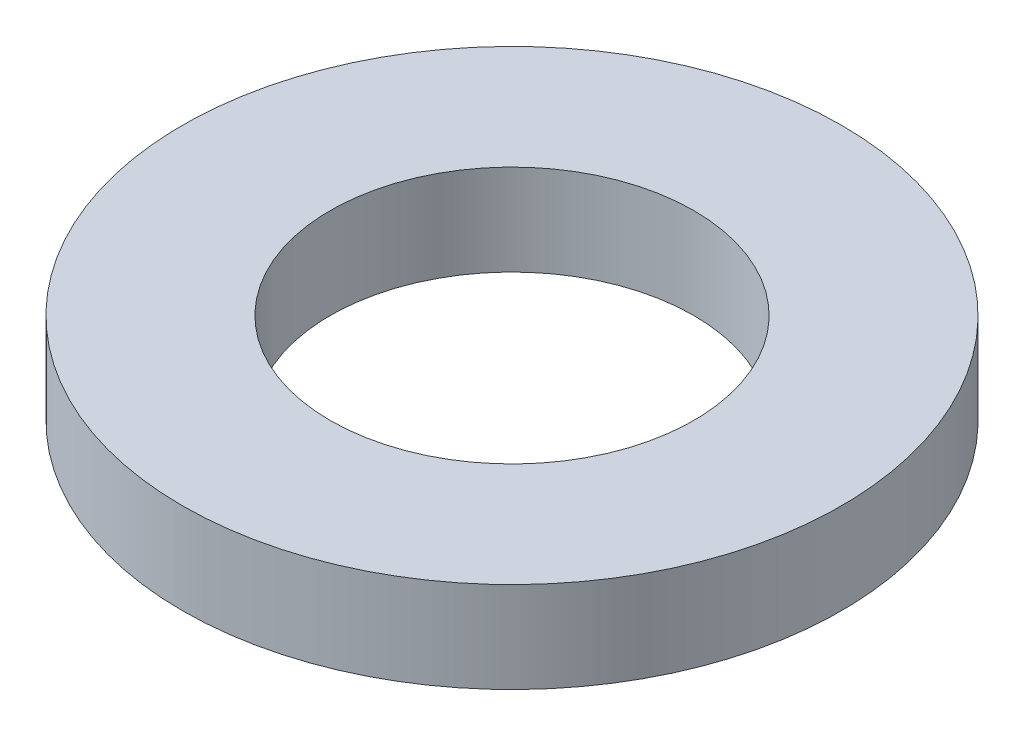
ISO-10303-21;
HEADER;
FILE_DESCRIPTION(('STEP AP214'),'2;1');
FILE_NAME('part.step','',(''),(''),'','','');
FILE_SCHEMA(('AUTOMOTIVE_DESIGN { 1 0 10303 214 1 1 1 1 }'));
ENDSEC;
DATA;
#1=APPLICATION_CONTEXT('core data for automotive mechanical design processes');
#2=APPLICATION_PROTOCOL_DEFINITION('international standard','automotive_design',2000,#1);
#3=PRODUCT_CONTEXT('',#1,'mechanical');
#4=PRODUCT('Part','Part','',(#3));
#5=PRODUCT_RELATED_PRODUCT_CATEGORY('part','',(#4));
#6=PRODUCT_DEFINITION_FORMATION('','',#4);
#7=PRODUCT_DEFINITION_CONTEXT('part definition',#1,'design');
#8=PRODUCT_DEFINITION('design','',#6,#7);
#9=PRODUCT_DEFINITION_SHAPE('','',#8);
#10=(LENGTH_UNIT() NAMED_UNIT(*) SI_UNIT(.MILLI.,.METRE.));
#11=(NAMED_UNIT(*) PLANE_ANGLE_UNIT() SI_UNIT($,.RADIAN.));
#12=(NAMED_UNIT(*) SI_UNIT($,.STERADIAN.) SOLID_ANGLE_UNIT());
#13=UNCERTAINTY_MEASURE_WITH_UNIT(LENGTH_MEASURE(1.E-05),#10,'distance_accuracy_value','');
#14=(GEOMETRIC_REPRESENTATION_CONTEXT(3) GLOBAL_UNCERTAINTY_ASSIGNED_CONTEXT((#13)) GLOBAL_UNIT_ASSIGNED_CONTEXT((#10,
#11,#12)) REPRESENTATION_CONTEXT('',''));
#15=CARTESIAN_POINT('',(0.,0.,0.));
#16=DIRECTION('',(0.,0.,1.));
#17=DIRECTION('',(1.,0.,0.));
#18=AXIS2_PLACEMENT_3D('',#15,#16,#17);
#19=CARTESIAN_POINT('',(0.,0.8,0.));
#20=DIRECTION('',(0.,1.,0.));
#21=DIRECTION('',(0.,0.,1.));
#22=AXIS2_PLACEMENT_3D('',#19,#20,#21);
#23=PLANE('',#22);
#24=CARTESIAN_POINT('',(0.,0.8,0.));
#25=DIRECTION('',(0.,1.,0.));
#26=DIRECTION('',(0.,0.,1.));
#27=AXIS2_PLACEMENT_3D('',#24,#25,#26);
#28=CIRCLE('',#27,2.9);
#29=CARTESIAN_POINT('',(0.,0.8,2.9));
#30=VERTEX_POINT('',#29);
#31=EDGE_CURVE('E10',#30,#30,#28,.T.);
#32=ORIENTED_EDGE('',*,*,#31,.T.);
#33=EDGE_LOOP('',(#32));
#34=FACE_BOUND('',#33,.T.);
#35=CARTESIAN_POINT('',(0.,0.8,0.));
#36=DIRECTION('',(0.,1.,0.));
#37=DIRECTION('',(0.,0.,1.));
#38=AXIS2_PLACEMENT_3D('',#35,#36,#37);
#39=CIRCLE('',#38,1.6);
#40=CARTESIAN_POINT('',(0.,0.8,1.6));
#41=VERTEX_POINT('',#40);
#42=EDGE_CURVE('E44',#41,#41,#39,.T.);
#43=ORIENTED_EDGE('',*,*,#42,.F.);
#44=EDGE_LOOP('',(#43));
#45=FACE_BOUND('',#44,.T.);
#46=ADVANCED_FACE('F33',(#34,#45),#23,.T.);
#47=CARTESIAN_POINT('',(0.,0.,0.));
#48=DIRECTION('',(0.,1.,0.));
#49=DIRECTION('',(0.,0.,1.));
#50=AXIS2_PLACEMENT_3D('',#47,#48,#49);
#51=PLANE('',#50);
#52=CARTESIAN_POINT('',(0.,0.,0.));
#53=DIRECTION('',(0.,1.,0.));
#54=DIRECTION('',(0.,0.,1.));
#55=AXIS2_PLACEMENT_3D('',#52,#53,#54);
#56=CIRCLE('',#55,2.9);
#57=CARTESIAN_POINT('',(0.,0.,2.9));
#58=VERTEX_POINT('',#57);
#59=EDGE_CURVE('E37',#58,#58,#56,.T.);
#60=ORIENTED_EDGE('',*,*,#59,.F.);
#61=EDGE_LOOP('',(#60));
#62=FACE_BOUND('',#61,.T.);
#63=CARTESIAN_POINT('',(0.,0.,0.));
#64=DIRECTION('',(0.,1.,0.));
#65=DIRECTION('',(0.,0.,1.));
#66=AXIS2_PLACEMENT_3D('',#63,#64,#65);
#67=CIRCLE('',#66,1.6);
#68=CARTESIAN_POINT('',(0.,0.,1.6));
#69=VERTEX_POINT('',#68);
#70=EDGE_CURVE('E46',#69,#69,#67,.T.);
#71=ORIENTED_EDGE('',*,*,#70,.T.);
#72=EDGE_LOOP('',(#71));
#73=FACE_BOUND('',#72,.T.);
#74=ADVANCED_FACE('F56',(#62,#73),#51,.F.);
#75=CARTESIAN_POINT('',(0.,0.8,0.));
#76=DIRECTION('',(0.,-1.,0.));
#77=DIRECTION('',(0.,0.,-1.));
#78=AXIS2_PLACEMENT_3D('',#75,#76,#77);
#79=CYLINDRICAL_SURFACE('',#78,2.9);
#80=ORIENTED_EDGE('',*,*,#31,.F.);
#81=EDGE_LOOP('',(#80));
#82=FACE_BOUND('',#81,.T.);
#83=ORIENTED_EDGE('',*,*,#59,.T.);
#84=EDGE_LOOP('',(#83));
#85=FACE_BOUND('',#84,.T.);
#86=ADVANCED_FACE('F35',(#82,#85),#79,.T.);
#87=CARTESIAN_POINT('',(0.,0.8,0.));
#88=DIRECTION('',(0.,-1.,0.));
#89=DIRECTION('',(0.,0.,-1.));
#90=AXIS2_PLACEMENT_3D('',#87,#88,#89);
#91=CYLINDRICAL_SURFACE('',#90,1.6);
#92=ORIENTED_EDGE('',*,*,#42,.T.);
#93=EDGE_LOOP('',(#92));
#94=FACE_BOUND('',#93,.T.);
#95=ORIENTED_EDGE('',*,*,#70,.F.);
#96=EDGE_LOOP('',(#95));
#97=FACE_BOUND('',#96,.T.);
#98=ADVANCED_FACE('F52',(#94,#97),#91,.F.);
#99=CLOSED_SHELL('',(#46,#74,#86,#98));
#100=MANIFOLD_SOLID_BREP('B2',#99);
#101=ADVANCED_BREP_SHAPE_REPRESENTATION('',(#18,#100),#14);
#102=SHAPE_DEFINITION_REPRESENTATION(#9,#101);
ENDSEC;
END-ISO-10303-21;
